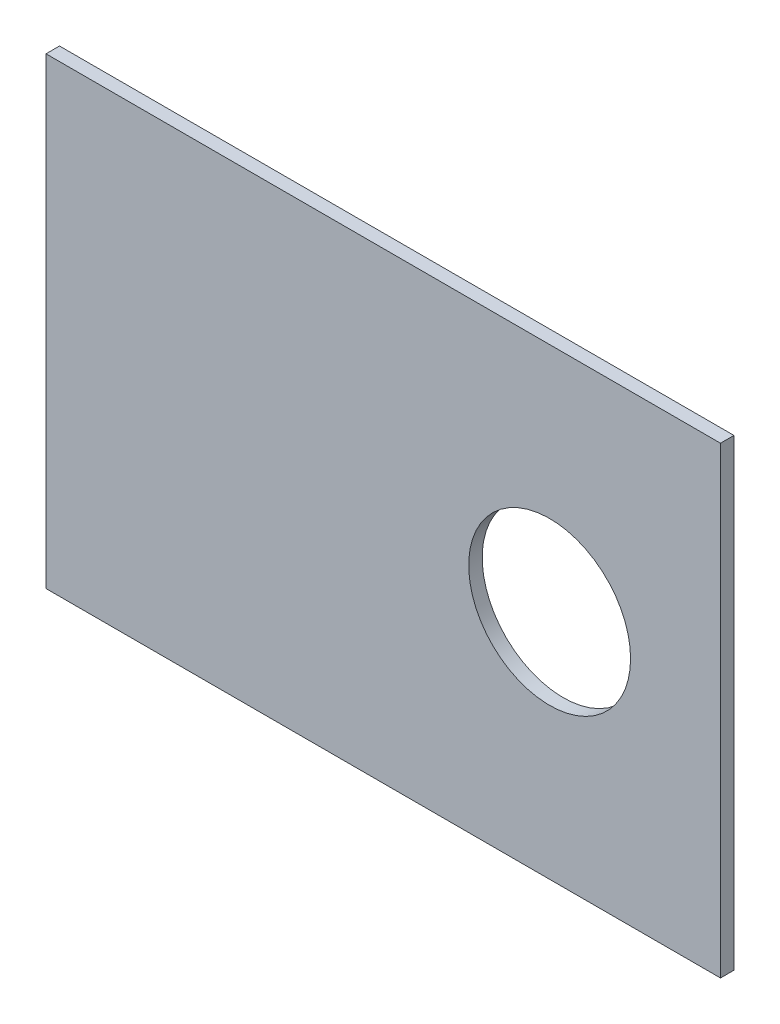
ISO-10303-21;
HEADER;
FILE_DESCRIPTION(('STEP AP214'),'2;1');
FILE_NAME('part.step','',(''),(''),'','','');
FILE_SCHEMA(('AUTOMOTIVE_DESIGN { 1 0 10303 214 1 1 1 1 }'));
ENDSEC;
DATA;
#1=APPLICATION_CONTEXT('core data for automotive mechanical design processes');
#2=APPLICATION_PROTOCOL_DEFINITION('international standard','automotive_design',2000,#1);
#3=PRODUCT_CONTEXT('',#1,'mechanical');
#4=PRODUCT('Part','Part','',(#3));
#5=PRODUCT_RELATED_PRODUCT_CATEGORY('part','',(#4));
#6=PRODUCT_DEFINITION_FORMATION('','',#4);
#7=PRODUCT_DEFINITION_CONTEXT('part definition',#1,'design');
#8=PRODUCT_DEFINITION('design','',#6,#7);
#9=PRODUCT_DEFINITION_SHAPE('','',#8);
#10=(LENGTH_UNIT() NAMED_UNIT(*) SI_UNIT(.MILLI.,.METRE.));
#11=(NAMED_UNIT(*) PLANE_ANGLE_UNIT() SI_UNIT($,.RADIAN.));
#12=(NAMED_UNIT(*) SI_UNIT($,.STERADIAN.) SOLID_ANGLE_UNIT());
#13=UNCERTAINTY_MEASURE_WITH_UNIT(LENGTH_MEASURE(1.E-05),#10,'distance_accuracy_value','');
#14=(GEOMETRIC_REPRESENTATION_CONTEXT(3) GLOBAL_UNCERTAINTY_ASSIGNED_CONTEXT((#13)) GLOBAL_UNIT_ASSIGNED_CONTEXT((#10,
#11,#12)) REPRESENTATION_CONTEXT('',''));
#15=CARTESIAN_POINT('',(0.,0.,0.));
#16=DIRECTION('',(0.,0.,1.));
#17=DIRECTION('',(1.,0.,0.));
#18=AXIS2_PLACEMENT_3D('',#15,#16,#17);
#19=CARTESIAN_POINT('',(0.,0.,3.));
#20=DIRECTION('',(0.,0.,-1.));
#21=DIRECTION('',(-1.,0.,0.));
#22=AXIS2_PLACEMENT_3D('',#19,#20,#21);
#23=PLANE('',#22);
#24=DIRECTION('',(0.,1.,0.));
#25=VECTOR('',#24,1.);
#26=CARTESIAN_POINT('',(75.,-51.5,3.));
#27=LINE('',#26,#25);
#28=CARTESIAN_POINT('',(75.,-51.5,3.));
#29=VERTEX_POINT('',#28);
#30=CARTESIAN_POINT('',(75.,51.5,3.));
#31=VERTEX_POINT('',#30);
#32=EDGE_CURVE('E84',#29,#31,#27,.T.);
#33=ORIENTED_EDGE('',*,*,#32,.T.);
#34=DIRECTION('',(-1.,0.,0.));
#35=VECTOR('',#34,1.);
#36=CARTESIAN_POINT('',(-75.,51.5,3.));
#37=LINE('',#36,#35);
#38=CARTESIAN_POINT('',(-75.,51.5,3.));
#39=VERTEX_POINT('',#38);
#40=EDGE_CURVE('E79',#31,#39,#37,.T.);
#41=ORIENTED_EDGE('',*,*,#40,.T.);
#42=DIRECTION('',(0.,-1.,0.));
#43=VECTOR('',#42,1.);
#44=CARTESIAN_POINT('',(-75.,-51.5,3.));
#45=LINE('',#44,#43);
#46=CARTESIAN_POINT('',(-75.,-51.5,3.));
#47=VERTEX_POINT('',#46);
#48=EDGE_CURVE('E82',#39,#47,#45,.T.);
#49=ORIENTED_EDGE('',*,*,#48,.T.);
#50=DIRECTION('',(1.,0.,0.));
#51=VECTOR('',#50,1.);
#52=CARTESIAN_POINT('',(-75.,-51.5,3.));
#53=LINE('',#52,#51);
#54=EDGE_CURVE('E49',#47,#29,#53,.T.);
#55=ORIENTED_EDGE('',*,*,#54,.T.);
#56=EDGE_LOOP('',(#33,#41,#49,#55));
#57=FACE_BOUND('',#56,.T.);
#58=CARTESIAN_POINT('',(37.,0.,3.));
#59=DIRECTION('',(0.,0.,1.));
#60=DIRECTION('',(1.,0.,0.));
#61=AXIS2_PLACEMENT_3D('',#58,#59,#60);
#62=CIRCLE('',#61,18.);
#63=CARTESIAN_POINT('',(55.,0.,3.));
#64=VERTEX_POINT('',#63);
#65=EDGE_CURVE('E99',#64,#64,#62,.T.);
#66=ORIENTED_EDGE('',*,*,#65,.F.);
#67=EDGE_LOOP('',(#66));
#68=FACE_BOUND('',#67,.T.);
#69=ADVANCED_FACE('F32',(#57,#68),#23,.F.);
#70=CARTESIAN_POINT('',(0.,0.,0.));
#71=DIRECTION('',(0.,0.,-1.));
#72=DIRECTION('',(-1.,0.,0.));
#73=AXIS2_PLACEMENT_3D('',#70,#71,#72);
#74=PLANE('',#73);
#75=DIRECTION('',(0.,1.,0.));
#76=VECTOR('',#75,1.);
#77=CARTESIAN_POINT('',(75.,-51.5,0.));
#78=LINE('',#77,#76);
#79=CARTESIAN_POINT('',(75.,-51.5,0.));
#80=VERTEX_POINT('',#79);
#81=CARTESIAN_POINT('',(75.,51.5,0.));
#82=VERTEX_POINT('',#81);
#83=EDGE_CURVE('E96',#80,#82,#78,.T.);
#84=ORIENTED_EDGE('',*,*,#83,.F.);
#85=DIRECTION('',(1.,0.,0.));
#86=VECTOR('',#85,1.);
#87=CARTESIAN_POINT('',(-75.,-51.5,0.));
#88=LINE('',#87,#86);
#89=CARTESIAN_POINT('',(-75.,-51.5,0.));
#90=VERTEX_POINT('',#89);
#91=EDGE_CURVE('E72',#90,#80,#88,.T.);
#92=ORIENTED_EDGE('',*,*,#91,.F.);
#93=DIRECTION('',(0.,-1.,0.));
#94=VECTOR('',#93,1.);
#95=CARTESIAN_POINT('',(-75.,-51.5,0.));
#96=LINE('',#95,#94);
#97=CARTESIAN_POINT('',(-75.,51.5,0.));
#98=VERTEX_POINT('',#97);
#99=EDGE_CURVE('E66',#98,#90,#96,.T.);
#100=ORIENTED_EDGE('',*,*,#99,.F.);
#101=DIRECTION('',(-1.,0.,0.));
#102=VECTOR('',#101,1.);
#103=CARTESIAN_POINT('',(-75.,51.5,0.));
#104=LINE('',#103,#102);
#105=EDGE_CURVE('E88',#82,#98,#104,.T.);
#106=ORIENTED_EDGE('',*,*,#105,.F.);
#107=EDGE_LOOP('',(#84,#92,#100,#106));
#108=FACE_BOUND('',#107,.T.);
#109=CARTESIAN_POINT('',(37.,0.,0.));
#110=DIRECTION('',(0.,0.,1.));
#111=DIRECTION('',(1.,0.,0.));
#112=AXIS2_PLACEMENT_3D('',#109,#110,#111);
#113=CIRCLE('',#112,18.);
#114=CARTESIAN_POINT('',(55.,0.,0.));
#115=VERTEX_POINT('',#114);
#116=EDGE_CURVE('E111',#115,#115,#113,.T.);
#117=ORIENTED_EDGE('',*,*,#116,.T.);
#118=EDGE_LOOP('',(#117));
#119=FACE_BOUND('',#118,.T.);
#120=ADVANCED_FACE('F107',(#108,#119),#74,.T.);
#121=CARTESIAN_POINT('',(75.,-51.5,3.));
#122=DIRECTION('',(-1.,0.,0.));
#123=DIRECTION('',(0.,0.,1.));
#124=AXIS2_PLACEMENT_3D('',#121,#122,#123);
#125=PLANE('',#124);
#126=ORIENTED_EDGE('',*,*,#83,.T.);
#127=DIRECTION('',(0.,0.,-1.));
#128=VECTOR('',#127,1.);
#129=CARTESIAN_POINT('',(75.,51.5,3.));
#130=LINE('',#129,#128);
#131=EDGE_CURVE('E11',#31,#82,#130,.T.);
#132=ORIENTED_EDGE('',*,*,#131,.F.);
#133=ORIENTED_EDGE('',*,*,#32,.F.);
#134=DIRECTION('',(0.,0.,-1.));
#135=VECTOR('',#134,1.);
#136=CARTESIAN_POINT('',(75.,-51.5,3.));
#137=LINE('',#136,#135);
#138=EDGE_CURVE('E92',#29,#80,#137,.T.);
#139=ORIENTED_EDGE('',*,*,#138,.T.);
#140=EDGE_LOOP('',(#126,#132,#133,#139));
#141=FACE_BOUND('',#140,.T.);
#142=ADVANCED_FACE('F34',(#141),#125,.F.);
#143=CARTESIAN_POINT('',(-75.,51.5,3.));
#144=DIRECTION('',(0.,-1.,0.));
#145=DIRECTION('',(0.,0.,-1.));
#146=AXIS2_PLACEMENT_3D('',#143,#144,#145);
#147=PLANE('',#146);
#148=ORIENTED_EDGE('',*,*,#105,.T.);
#149=DIRECTION('',(0.,0.,-1.));
#150=VECTOR('',#149,1.);
#151=CARTESIAN_POINT('',(-75.,51.5,3.));
#152=LINE('',#151,#150);
#153=EDGE_CURVE('E41',#39,#98,#152,.T.);
#154=ORIENTED_EDGE('',*,*,#153,.F.);
#155=ORIENTED_EDGE('',*,*,#40,.F.);
#156=ORIENTED_EDGE('',*,*,#131,.T.);
#157=EDGE_LOOP('',(#148,#154,#155,#156));
#158=FACE_BOUND('',#157,.T.);
#159=ADVANCED_FACE('F87',(#158),#147,.F.);
#160=CARTESIAN_POINT('',(-75.,-51.5,3.));
#161=DIRECTION('',(1.,0.,0.));
#162=DIRECTION('',(0.,0.,-1.));
#163=AXIS2_PLACEMENT_3D('',#160,#161,#162);
#164=PLANE('',#163);
#165=ORIENTED_EDGE('',*,*,#99,.T.);
#166=DIRECTION('',(0.,0.,-1.));
#167=VECTOR('',#166,1.);
#168=CARTESIAN_POINT('',(-75.,-51.5,3.));
#169=LINE('',#168,#167);
#170=EDGE_CURVE('E89',#47,#90,#169,.T.);
#171=ORIENTED_EDGE('',*,*,#170,.F.);
#172=ORIENTED_EDGE('',*,*,#48,.F.);
#173=ORIENTED_EDGE('',*,*,#153,.T.);
#174=EDGE_LOOP('',(#165,#171,#172,#173));
#175=FACE_BOUND('',#174,.T.);
#176=ADVANCED_FACE('F90',(#175),#164,.F.);
#177=CARTESIAN_POINT('',(-75.,-51.5,3.));
#178=DIRECTION('',(0.,1.,0.));
#179=DIRECTION('',(0.,0.,1.));
#180=AXIS2_PLACEMENT_3D('',#177,#178,#179);
#181=PLANE('',#180);
#182=ORIENTED_EDGE('',*,*,#91,.T.);
#183=ORIENTED_EDGE('',*,*,#138,.F.);
#184=ORIENTED_EDGE('',*,*,#54,.F.);
#185=ORIENTED_EDGE('',*,*,#170,.T.);
#186=EDGE_LOOP('',(#182,#183,#184,#185));
#187=FACE_BOUND('',#186,.T.);
#188=ADVANCED_FACE('F104',(#187),#181,.F.);
#189=CARTESIAN_POINT('',(37.,0.,3.));
#190=DIRECTION('',(0.,0.,-1.));
#191=DIRECTION('',(-1.,0.,0.));
#192=AXIS2_PLACEMENT_3D('',#189,#190,#191);
#193=CYLINDRICAL_SURFACE('',#192,18.);
#194=ORIENTED_EDGE('',*,*,#65,.T.);
#195=EDGE_LOOP('',(#194));
#196=FACE_BOUND('',#195,.T.);
#197=ORIENTED_EDGE('',*,*,#116,.F.);
#198=EDGE_LOOP('',(#197));
#199=FACE_BOUND('',#198,.T.);
#200=ADVANCED_FACE('F117',(#196,#199),#193,.F.);
#201=CLOSED_SHELL('',(#69,#120,#142,#159,#176,#188,#200));
#202=MANIFOLD_SOLID_BREP('B2',#201);
#203=ADVANCED_BREP_SHAPE_REPRESENTATION('',(#18,#202),#14);
#204=SHAPE_DEFINITION_REPRESENTATION(#9,#203);
ENDSEC;
END-ISO-10303-21;
